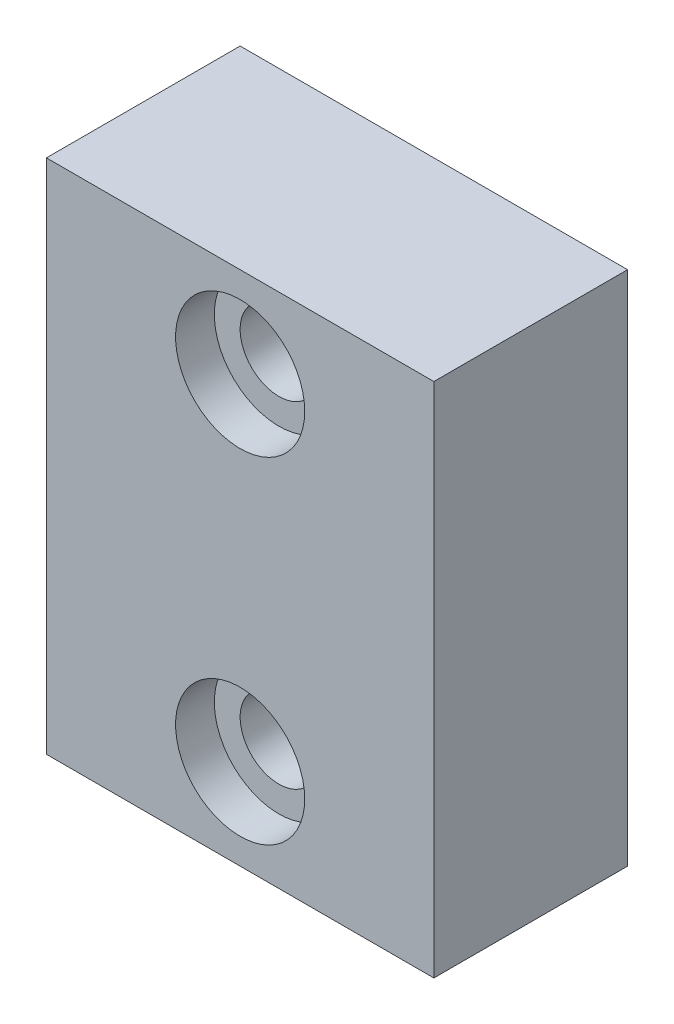
ISO-10303-21;
HEADER;
FILE_DESCRIPTION(('STEP AP214'),'2;1');
FILE_NAME('part.step','',(''),(''),'','','');
FILE_SCHEMA(('AUTOMOTIVE_DESIGN { 1 0 10303 214 1 1 1 1 }'));
ENDSEC;
DATA;
#1=APPLICATION_CONTEXT('core data for automotive mechanical design processes');
#2=APPLICATION_PROTOCOL_DEFINITION('international standard','automotive_design',2000,#1);
#3=PRODUCT_CONTEXT('',#1,'mechanical');
#4=PRODUCT('Part','Part','',(#3));
#5=PRODUCT_RELATED_PRODUCT_CATEGORY('part','',(#4));
#6=PRODUCT_DEFINITION_FORMATION('','',#4);
#7=PRODUCT_DEFINITION_CONTEXT('part definition',#1,'design');
#8=PRODUCT_DEFINITION('design','',#6,#7);
#9=PRODUCT_DEFINITION_SHAPE('','',#8);
#10=(LENGTH_UNIT() NAMED_UNIT(*) SI_UNIT(.MILLI.,.METRE.));
#11=(NAMED_UNIT(*) PLANE_ANGLE_UNIT() SI_UNIT($,.RADIAN.));
#12=(NAMED_UNIT(*) SI_UNIT($,.STERADIAN.) SOLID_ANGLE_UNIT());
#13=UNCERTAINTY_MEASURE_WITH_UNIT(LENGTH_MEASURE(1.E-05),#10,'distance_accuracy_value','');
#14=(GEOMETRIC_REPRESENTATION_CONTEXT(3) GLOBAL_UNCERTAINTY_ASSIGNED_CONTEXT((#13)) GLOBAL_UNIT_ASSIGNED_CONTEXT((#10,
#11,#12)) REPRESENTATION_CONTEXT('',''));
#15=CARTESIAN_POINT('',(0.,0.,0.));
#16=DIRECTION('',(0.,0.,1.));
#17=DIRECTION('',(1.,0.,0.));
#18=AXIS2_PLACEMENT_3D('',#15,#16,#17);
#19=CARTESIAN_POINT('',(0.901187862631331,-13.21875,0.));
#20=DIRECTION('',(0.,0.,1.));
#21=DIRECTION('',(1.,0.,0.));
#22=AXIS2_PLACEMENT_3D('',#19,#20,#21);
#23=CYLINDRICAL_SURFACE('',#22,1.5);
#24=CARTESIAN_POINT('',(0.901187862631331,-13.21875,0.));
#25=DIRECTION('',(0.,0.,1.));
#26=DIRECTION('',(1.,0.,0.));
#27=AXIS2_PLACEMENT_3D('',#24,#25,#26);
#28=CIRCLE('',#27,1.5);
#29=CARTESIAN_POINT('',(2.40118786263133,-13.21875,0.));
#30=VERTEX_POINT('',#29);
#31=EDGE_CURVE('E114',#30,#30,#28,.T.);
#32=ORIENTED_EDGE('',*,*,#31,.F.);
#33=EDGE_LOOP('',(#32));
#34=FACE_BOUND('',#33,.T.);
#35=CARTESIAN_POINT('',(0.901187862631331,-13.21875,6.));
#36=DIRECTION('',(0.,0.,1.));
#37=DIRECTION('',(1.,0.,0.));
#38=AXIS2_PLACEMENT_3D('',#35,#36,#37);
#39=CIRCLE('',#38,1.5);
#40=CARTESIAN_POINT('',(2.40118786263133,-13.21875,6.));
#41=VERTEX_POINT('',#40);
#42=EDGE_CURVE('E37',#41,#41,#39,.F.);
#43=ORIENTED_EDGE('',*,*,#42,.F.);
#44=EDGE_LOOP('',(#43));
#45=FACE_BOUND('',#44,.T.);
#46=ADVANCED_FACE('F33',(#34,#45),#23,.F.);
#47=CARTESIAN_POINT('',(0.901187862631331,-0.218749999999998,0.));
#48=DIRECTION('',(0.,0.,1.));
#49=DIRECTION('',(1.,0.,0.));
#50=AXIS2_PLACEMENT_3D('',#47,#48,#49);
#51=CYLINDRICAL_SURFACE('',#50,1.5);
#52=CARTESIAN_POINT('',(0.901187862631331,-0.218749999999998,0.));
#53=DIRECTION('',(0.,0.,1.));
#54=DIRECTION('',(1.,0.,0.));
#55=AXIS2_PLACEMENT_3D('',#52,#53,#54);
#56=CIRCLE('',#55,1.5);
#57=CARTESIAN_POINT('',(2.40118786263133,-0.218749999999998,0.));
#58=VERTEX_POINT('',#57);
#59=EDGE_CURVE('E103',#58,#58,#56,.T.);
#60=ORIENTED_EDGE('',*,*,#59,.F.);
#61=EDGE_LOOP('',(#60));
#62=FACE_BOUND('',#61,.T.);
#63=CARTESIAN_POINT('',(0.901187862631331,-0.218749999999998,6.));
#64=DIRECTION('',(0.,0.,1.));
#65=DIRECTION('',(1.,0.,0.));
#66=AXIS2_PLACEMENT_3D('',#63,#64,#65);
#67=CIRCLE('',#66,1.5);
#68=CARTESIAN_POINT('',(2.40118786263133,-0.218749999999998,6.));
#69=VERTEX_POINT('',#68);
#70=EDGE_CURVE('E108',#69,#69,#67,.F.);
#71=ORIENTED_EDGE('',*,*,#70,.F.);
#72=EDGE_LOOP('',(#71));
#73=FACE_BOUND('',#72,.T.);
#74=ADVANCED_FACE('F139',(#62,#73),#51,.F.);
#75=CARTESIAN_POINT('',(-6.59881213736867,3.28125,7.5));
#76=DIRECTION('',(1.,0.,0.));
#77=DIRECTION('',(0.,1.,0.));
#78=AXIS2_PLACEMENT_3D('',#75,#76,#77);
#79=PLANE('',#78);
#80=DIRECTION('',(0.,-1.,0.));
#81=VECTOR('',#80,1.);
#82=CARTESIAN_POINT('',(-6.59881213736867,3.28125,0.));
#83=LINE('',#82,#81);
#84=CARTESIAN_POINT('',(-6.59881213736867,3.28125,0.));
#85=VERTEX_POINT('',#84);
#86=CARTESIAN_POINT('',(-6.59881213736867,-16.71875,0.));
#87=VERTEX_POINT('',#86);
#88=EDGE_CURVE('E100',#85,#87,#83,.T.);
#89=ORIENTED_EDGE('',*,*,#88,.T.);
#90=DIRECTION('',(0.,0.,-1.));
#91=VECTOR('',#90,1.);
#92=CARTESIAN_POINT('',(-6.59881213736867,-16.71875,7.5));
#93=LINE('',#92,#91);
#94=CARTESIAN_POINT('',(-6.59881213736867,-16.71875,7.5));
#95=VERTEX_POINT('',#94);
#96=EDGE_CURVE('E11',#95,#87,#93,.T.);
#97=ORIENTED_EDGE('',*,*,#96,.F.);
#98=DIRECTION('',(0.,-1.,0.));
#99=VECTOR('',#98,1.);
#100=CARTESIAN_POINT('',(-6.59881213736867,3.28125,7.5));
#101=LINE('',#100,#99);
#102=CARTESIAN_POINT('',(-6.59881213736867,3.28125,7.5));
#103=VERTEX_POINT('',#102);
#104=EDGE_CURVE('E87',#103,#95,#101,.T.);
#105=ORIENTED_EDGE('',*,*,#104,.F.);
#106=DIRECTION('',(0.,0.,-1.));
#107=VECTOR('',#106,1.);
#108=CARTESIAN_POINT('',(-6.59881213736867,3.28125,7.5));
#109=LINE('',#108,#107);
#110=EDGE_CURVE('E96',#103,#85,#109,.T.);
#111=ORIENTED_EDGE('',*,*,#110,.T.);
#112=EDGE_LOOP('',(#89,#97,#105,#111));
#113=FACE_BOUND('',#112,.T.);
#114=ADVANCED_FACE('F35',(#113),#79,.F.);
#115=CARTESIAN_POINT('',(-6.59881213736867,-16.71875,7.5));
#116=DIRECTION('',(0.,1.,0.));
#117=DIRECTION('',(0.,0.,1.));
#118=AXIS2_PLACEMENT_3D('',#115,#116,#117);
#119=PLANE('',#118);
#120=DIRECTION('',(1.,0.,0.));
#121=VECTOR('',#120,1.);
#122=CARTESIAN_POINT('',(-6.59881213736867,-16.71875,0.));
#123=LINE('',#122,#121);
#124=CARTESIAN_POINT('',(8.40118786263133,-16.71875,0.));
#125=VERTEX_POINT('',#124);
#126=EDGE_CURVE('E91',#87,#125,#123,.T.);
#127=ORIENTED_EDGE('',*,*,#126,.T.);
#128=DIRECTION('',(0.,0.,-1.));
#129=VECTOR('',#128,1.);
#130=CARTESIAN_POINT('',(8.40118786263133,-16.71875,7.5));
#131=LINE('',#130,#129);
#132=CARTESIAN_POINT('',(8.40118786263133,-16.71875,7.5));
#133=VERTEX_POINT('',#132);
#134=EDGE_CURVE('E43',#133,#125,#131,.T.);
#135=ORIENTED_EDGE('',*,*,#134,.F.);
#136=DIRECTION('',(1.,0.,0.));
#137=VECTOR('',#136,1.);
#138=CARTESIAN_POINT('',(-6.59881213736867,-16.71875,7.5));
#139=LINE('',#138,#137);
#140=EDGE_CURVE('E82',#95,#133,#139,.T.);
#141=ORIENTED_EDGE('',*,*,#140,.F.);
#142=ORIENTED_EDGE('',*,*,#96,.T.);
#143=EDGE_LOOP('',(#127,#135,#141,#142));
#144=FACE_BOUND('',#143,.T.);
#145=ADVANCED_FACE('F90',(#144),#119,.F.);
#146=CARTESIAN_POINT('',(8.40118786263133,3.28125,7.5));
#147=DIRECTION('',(-1.,0.,0.));
#148=DIRECTION('',(0.,-1.,0.));
#149=AXIS2_PLACEMENT_3D('',#146,#147,#148);
#150=PLANE('',#149);
#151=DIRECTION('',(0.,1.,0.));
#152=VECTOR('',#151,1.);
#153=CARTESIAN_POINT('',(8.40118786263133,3.28125,0.));
#154=LINE('',#153,#152);
#155=CARTESIAN_POINT('',(8.40118786263133,3.28125,0.));
#156=VERTEX_POINT('',#155);
#157=EDGE_CURVE('E69',#125,#156,#154,.T.);
#158=ORIENTED_EDGE('',*,*,#157,.T.);
#159=DIRECTION('',(0.,0.,-1.));
#160=VECTOR('',#159,1.);
#161=CARTESIAN_POINT('',(8.40118786263133,3.28125,7.5));
#162=LINE('',#161,#160);
#163=CARTESIAN_POINT('',(8.40118786263133,3.28125,7.5));
#164=VERTEX_POINT('',#163);
#165=EDGE_CURVE('E92',#164,#156,#162,.T.);
#166=ORIENTED_EDGE('',*,*,#165,.F.);
#167=DIRECTION('',(0.,1.,0.));
#168=VECTOR('',#167,1.);
#169=CARTESIAN_POINT('',(8.40118786263133,3.28125,7.5));
#170=LINE('',#169,#168);
#171=EDGE_CURVE('E85',#133,#164,#170,.T.);
#172=ORIENTED_EDGE('',*,*,#171,.F.);
#173=ORIENTED_EDGE('',*,*,#134,.T.);
#174=EDGE_LOOP('',(#158,#166,#172,#173));
#175=FACE_BOUND('',#174,.T.);
#176=ADVANCED_FACE('F94',(#175),#150,.F.);
#177=CARTESIAN_POINT('',(-6.59881213736867,3.28125,7.5));
#178=DIRECTION('',(0.,-1.,0.));
#179=DIRECTION('',(0.,0.,-1.));
#180=AXIS2_PLACEMENT_3D('',#177,#178,#179);
#181=PLANE('',#180);
#182=DIRECTION('',(-1.,0.,0.));
#183=VECTOR('',#182,1.);
#184=CARTESIAN_POINT('',(-6.59881213736867,3.28125,0.));
#185=LINE('',#184,#183);
#186=EDGE_CURVE('E75',#156,#85,#185,.T.);
#187=ORIENTED_EDGE('',*,*,#186,.T.);
#188=ORIENTED_EDGE('',*,*,#110,.F.);
#189=DIRECTION('',(-1.,0.,0.));
#190=VECTOR('',#189,1.);
#191=CARTESIAN_POINT('',(-6.59881213736867,3.28125,7.5));
#192=LINE('',#191,#190);
#193=EDGE_CURVE('E52',#164,#103,#192,.T.);
#194=ORIENTED_EDGE('',*,*,#193,.F.);
#195=ORIENTED_EDGE('',*,*,#165,.T.);
#196=EDGE_LOOP('',(#187,#188,#194,#195));
#197=FACE_BOUND('',#196,.T.);
#198=ADVANCED_FACE('F165',(#197),#181,.F.);
#199=CARTESIAN_POINT('',(0.,0.,7.5));
#200=DIRECTION('',(0.,0.,1.));
#201=DIRECTION('',(1.,0.,0.));
#202=AXIS2_PLACEMENT_3D('',#199,#200,#201);
#203=PLANE('',#202);
#204=CARTESIAN_POINT('',(0.901187862631331,-0.218749999999998,7.5));
#205=DIRECTION('',(0.,0.,1.));
#206=DIRECTION('',(1.,0.,0.));
#207=AXIS2_PLACEMENT_3D('',#204,#205,#206);
#208=CIRCLE('',#207,2.5);
#209=CARTESIAN_POINT('',(3.40118786263133,-0.218749999999998,7.5));
#210=VERTEX_POINT('',#209);
#211=EDGE_CURVE('E116',#210,#210,#208,.T.);
#212=ORIENTED_EDGE('',*,*,#211,.F.);
#213=EDGE_LOOP('',(#212));
#214=FACE_BOUND('',#213,.T.);
#215=CARTESIAN_POINT('',(0.901187862631331,-13.21875,7.5));
#216=DIRECTION('',(0.,0.,1.));
#217=DIRECTION('',(1.,0.,0.));
#218=AXIS2_PLACEMENT_3D('',#215,#216,#217);
#219=CIRCLE('',#218,2.5);
#220=CARTESIAN_POINT('',(3.40118786263133,-13.21875,7.5));
#221=VERTEX_POINT('',#220);
#222=EDGE_CURVE('E126',#221,#221,#219,.T.);
#223=ORIENTED_EDGE('',*,*,#222,.F.);
#224=EDGE_LOOP('',(#223));
#225=FACE_BOUND('',#224,.T.);
#226=ORIENTED_EDGE('',*,*,#104,.T.);
#227=ORIENTED_EDGE('',*,*,#140,.T.);
#228=ORIENTED_EDGE('',*,*,#171,.T.);
#229=ORIENTED_EDGE('',*,*,#193,.T.);
#230=EDGE_LOOP('',(#226,#227,#228,#229));
#231=FACE_BOUND('',#230,.T.);
#232=ADVANCED_FACE('F83',(#214,#225,#231),#203,.T.);
#233=CARTESIAN_POINT('',(0.,0.,0.));
#234=DIRECTION('',(0.,0.,1.));
#235=DIRECTION('',(1.,0.,0.));
#236=AXIS2_PLACEMENT_3D('',#233,#234,#235);
#237=PLANE('',#236);
#238=ORIENTED_EDGE('',*,*,#59,.T.);
#239=EDGE_LOOP('',(#238));
#240=FACE_BOUND('',#239,.T.);
#241=ORIENTED_EDGE('',*,*,#31,.T.);
#242=EDGE_LOOP('',(#241));
#243=FACE_BOUND('',#242,.T.);
#244=ORIENTED_EDGE('',*,*,#88,.F.);
#245=ORIENTED_EDGE('',*,*,#186,.F.);
#246=ORIENTED_EDGE('',*,*,#157,.F.);
#247=ORIENTED_EDGE('',*,*,#126,.F.);
#248=EDGE_LOOP('',(#244,#245,#246,#247));
#249=FACE_BOUND('',#248,.T.);
#250=ADVANCED_FACE('F134',(#240,#243,#249),#237,.F.);
#251=CARTESIAN_POINT('',(0.901187862631331,-0.218749999999998,6.));
#252=DIRECTION('',(0.,0.,1.));
#253=DIRECTION('',(1.,0.,0.));
#254=AXIS2_PLACEMENT_3D('',#251,#252,#253);
#255=PLANE('',#254);
#256=CARTESIAN_POINT('',(0.901187862631331,-0.218749999999998,6.));
#257=DIRECTION('',(0.,0.,1.));
#258=DIRECTION('',(1.,0.,0.));
#259=AXIS2_PLACEMENT_3D('',#256,#257,#258);
#260=CIRCLE('',#259,2.5);
#261=CARTESIAN_POINT('',(3.40118786263133,-0.218749999999998,6.));
#262=VERTEX_POINT('',#261);
#263=EDGE_CURVE('E110',#262,#262,#260,.T.);
#264=ORIENTED_EDGE('',*,*,#263,.T.);
#265=EDGE_LOOP('',(#264));
#266=FACE_BOUND('',#265,.T.);
#267=ORIENTED_EDGE('',*,*,#70,.T.);
#268=EDGE_LOOP('',(#267));
#269=FACE_BOUND('',#268,.T.);
#270=ADVANCED_FACE('F155',(#266,#269),#255,.T.);
#271=CARTESIAN_POINT('',(0.901187862631331,-0.218749999999998,6.));
#272=DIRECTION('',(0.,0.,1.));
#273=DIRECTION('',(1.,0.,0.));
#274=AXIS2_PLACEMENT_3D('',#271,#272,#273);
#275=CYLINDRICAL_SURFACE('',#274,2.5);
#276=ORIENTED_EDGE('',*,*,#263,.F.);
#277=EDGE_LOOP('',(#276));
#278=FACE_BOUND('',#277,.T.);
#279=ORIENTED_EDGE('',*,*,#211,.T.);
#280=EDGE_LOOP('',(#279));
#281=FACE_BOUND('',#280,.T.);
#282=ADVANCED_FACE('F146',(#278,#281),#275,.F.);
#283=CARTESIAN_POINT('',(0.901187862631331,-13.21875,6.));
#284=DIRECTION('',(0.,0.,1.));
#285=DIRECTION('',(1.,0.,0.));
#286=AXIS2_PLACEMENT_3D('',#283,#284,#285);
#287=PLANE('',#286);
#288=CARTESIAN_POINT('',(0.901187862631331,-13.21875,6.));
#289=DIRECTION('',(0.,0.,1.));
#290=DIRECTION('',(1.,0.,0.));
#291=AXIS2_PLACEMENT_3D('',#288,#289,#290);
#292=CIRCLE('',#291,2.5);
#293=CARTESIAN_POINT('',(3.40118786263133,-13.21875,6.));
#294=VERTEX_POINT('',#293);
#295=EDGE_CURVE('E121',#294,#294,#292,.T.);
#296=ORIENTED_EDGE('',*,*,#295,.T.);
#297=EDGE_LOOP('',(#296));
#298=FACE_BOUND('',#297,.T.);
#299=ORIENTED_EDGE('',*,*,#42,.T.);
#300=EDGE_LOOP('',(#299));
#301=FACE_BOUND('',#300,.T.);
#302=ADVANCED_FACE('F143',(#298,#301),#287,.T.);
#303=CARTESIAN_POINT('',(0.901187862631331,-13.21875,6.));
#304=DIRECTION('',(0.,0.,1.));
#305=DIRECTION('',(1.,0.,0.));
#306=AXIS2_PLACEMENT_3D('',#303,#304,#305);
#307=CYLINDRICAL_SURFACE('',#306,2.5);
#308=ORIENTED_EDGE('',*,*,#295,.F.);
#309=EDGE_LOOP('',(#308));
#310=FACE_BOUND('',#309,.T.);
#311=ORIENTED_EDGE('',*,*,#222,.T.);
#312=EDGE_LOOP('',(#311));
#313=FACE_BOUND('',#312,.T.);
#314=ADVANCED_FACE('F145',(#310,#313),#307,.F.);
#315=CLOSED_SHELL('',(#46,#74,#114,#145,#176,#198,#232,#250,#270,#282,#302,#314));
#316=MANIFOLD_SOLID_BREP('B2',#315);
#317=ADVANCED_BREP_SHAPE_REPRESENTATION('',(#18,#316),#14);
#318=SHAPE_DEFINITION_REPRESENTATION(#9,#317);
ENDSEC;
END-ISO-10303-21;
